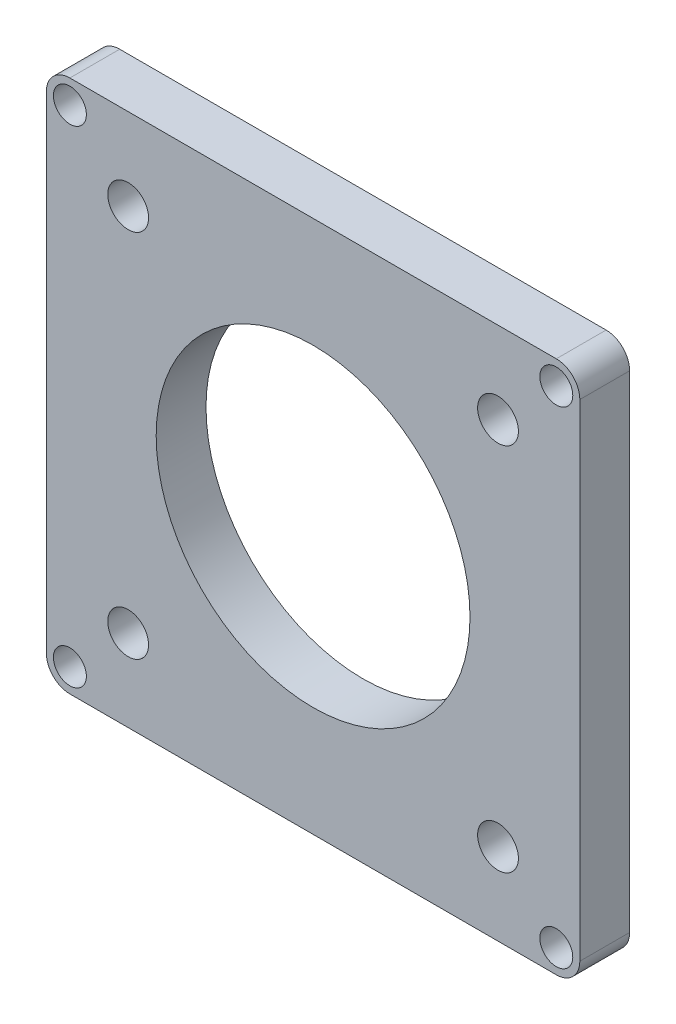
ISO-10303-21;
HEADER;
FILE_DESCRIPTION(('STEP AP214'),'2;1');
FILE_NAME('part.step','',(''),(''),'','','');
FILE_SCHEMA(('AUTOMOTIVE_DESIGN { 1 0 10303 214 1 1 1 1 }'));
ENDSEC;
DATA;
#1=APPLICATION_CONTEXT('core data for automotive mechanical design processes');
#2=APPLICATION_PROTOCOL_DEFINITION('international standard','automotive_design',2000,#1);
#3=PRODUCT_CONTEXT('',#1,'mechanical');
#4=PRODUCT('Part','Part','',(#3));
#5=PRODUCT_RELATED_PRODUCT_CATEGORY('part','',(#4));
#6=PRODUCT_DEFINITION_FORMATION('','',#4);
#7=PRODUCT_DEFINITION_CONTEXT('part definition',#1,'design');
#8=PRODUCT_DEFINITION('design','',#6,#7);
#9=PRODUCT_DEFINITION_SHAPE('','',#8);
#10=(LENGTH_UNIT() NAMED_UNIT(*) SI_UNIT(.MILLI.,.METRE.));
#11=(NAMED_UNIT(*) PLANE_ANGLE_UNIT() SI_UNIT($,.RADIAN.));
#12=(NAMED_UNIT(*) SI_UNIT($,.STERADIAN.) SOLID_ANGLE_UNIT());
#13=UNCERTAINTY_MEASURE_WITH_UNIT(LENGTH_MEASURE(1.E-05),#10,'distance_accuracy_value','');
#14=(GEOMETRIC_REPRESENTATION_CONTEXT(3) GLOBAL_UNCERTAINTY_ASSIGNED_CONTEXT((#13)) GLOBAL_UNIT_ASSIGNED_CONTEXT((#10,
#11,#12)) REPRESENTATION_CONTEXT('',''));
#15=CARTESIAN_POINT('',(0.,0.,0.));
#16=DIRECTION('',(0.,0.,1.));
#17=DIRECTION('',(1.,0.,0.));
#18=AXIS2_PLACEMENT_3D('',#15,#16,#17);
#19=CARTESIAN_POINT('',(0.,0.,3.175));
#20=DIRECTION('',(0.,0.,1.));
#21=DIRECTION('',(1.,0.,0.));
#22=AXIS2_PLACEMENT_3D('',#19,#20,#21);
#23=PLANE('',#22);
#24=CARTESIAN_POINT('',(-23.5700000000002,-23.5699999999998,3.175));
#25=DIRECTION('',(0.,0.,1.));
#26=DIRECTION('',(1.,0.,0.));
#27=AXIS2_PLACEMENT_3D('',#24,#25,#26);
#28=CIRCLE('',#27,2.6);
#29=CARTESIAN_POINT('',(-20.9700000000002,-23.5699999999998,3.175));
#30=VERTEX_POINT('',#29);
#31=EDGE_CURVE('E360',#30,#30,#28,.T.);
#32=ORIENTED_EDGE('',*,*,#31,.F.);
#33=EDGE_LOOP('',(#32));
#34=FACE_BOUND('',#33,.T.);
#35=CARTESIAN_POINT('',(23.5699999999998,-23.5700000000002,3.175));
#36=DIRECTION('',(0.,0.,1.));
#37=DIRECTION('',(1.,0.,0.));
#38=AXIS2_PLACEMENT_3D('',#35,#36,#37);
#39=CIRCLE('',#38,2.6);
#40=CARTESIAN_POINT('',(26.1699999999998,-23.5700000000002,3.175));
#41=VERTEX_POINT('',#40);
#42=EDGE_CURVE('E343',#41,#41,#39,.T.);
#43=ORIENTED_EDGE('',*,*,#42,.F.);
#44=EDGE_LOOP('',(#43));
#45=FACE_BOUND('',#44,.T.);
#46=CARTESIAN_POINT('',(31.,31.,3.175));
#47=DIRECTION('',(0.,0.,1.));
#48=DIRECTION('',(1.,0.,0.));
#49=AXIS2_PLACEMENT_3D('',#46,#47,#48);
#50=CIRCLE('',#49,2.1);
#51=CARTESIAN_POINT('',(33.1,31.,3.175));
#52=VERTEX_POINT('',#51);
#53=EDGE_CURVE('E334',#52,#52,#50,.T.);
#54=ORIENTED_EDGE('',*,*,#53,.F.);
#55=EDGE_LOOP('',(#54));
#56=FACE_BOUND('',#55,.T.);
#57=CARTESIAN_POINT('',(-23.57,23.57,3.175));
#58=DIRECTION('',(0.,0.,1.));
#59=DIRECTION('',(1.,0.,0.));
#60=AXIS2_PLACEMENT_3D('',#57,#58,#59);
#61=CIRCLE('',#60,2.6);
#62=CARTESIAN_POINT('',(-20.97,23.57,3.175));
#63=VERTEX_POINT('',#62);
#64=EDGE_CURVE('E325',#63,#63,#61,.T.);
#65=ORIENTED_EDGE('',*,*,#64,.F.);
#66=EDGE_LOOP('',(#65));
#67=FACE_BOUND('',#66,.T.);
#68=DIRECTION('',(1.,0.,0.));
#69=VECTOR('',#68,1.);
#70=CARTESIAN_POINT('',(-34.,34.,3.175));
#71=LINE('',#70,#69);
#72=CARTESIAN_POINT('',(-31.,34.,3.175));
#73=VERTEX_POINT('',#72);
#74=CARTESIAN_POINT('',(31.,34.,3.175));
#75=VERTEX_POINT('',#74);
#76=EDGE_CURVE('E280',#73,#75,#71,.T.);
#77=ORIENTED_EDGE('',*,*,#76,.F.);
#78=CARTESIAN_POINT('',(-31.,31.,3.175));
#79=DIRECTION('',(0.,0.,1.));
#80=DIRECTION('',(1.,0.,0.));
#81=AXIS2_PLACEMENT_3D('',#78,#79,#80);
#82=CIRCLE('',#81,3.);
#83=CARTESIAN_POINT('',(-34.,31.,3.175));
#84=VERTEX_POINT('',#83);
#85=EDGE_CURVE('E300',#73,#84,#82,.T.);
#86=ORIENTED_EDGE('',*,*,#85,.T.);
#87=DIRECTION('',(0.,-1.,0.));
#88=VECTOR('',#87,1.);
#89=CARTESIAN_POINT('',(-34.,34.,3.175));
#90=LINE('',#89,#88);
#91=CARTESIAN_POINT('',(-34.,-31.,3.175));
#92=VERTEX_POINT('',#91);
#93=EDGE_CURVE('E257',#84,#92,#90,.T.);
#94=ORIENTED_EDGE('',*,*,#93,.T.);
#95=CARTESIAN_POINT('',(-31.,-31.,3.175));
#96=DIRECTION('',(0.,0.,1.));
#97=DIRECTION('',(1.,0.,0.));
#98=AXIS2_PLACEMENT_3D('',#95,#96,#97);
#99=CIRCLE('',#98,3.);
#100=CARTESIAN_POINT('',(-31.,-34.,3.175));
#101=VERTEX_POINT('',#100);
#102=EDGE_CURVE('E293',#92,#101,#99,.T.);
#103=ORIENTED_EDGE('',*,*,#102,.T.);
#104=DIRECTION('',(1.,0.,0.));
#105=VECTOR('',#104,1.);
#106=CARTESIAN_POINT('',(-34.,-34.,3.175));
#107=LINE('',#106,#105);
#108=CARTESIAN_POINT('',(31.,-34.,3.175));
#109=VERTEX_POINT('',#108);
#110=EDGE_CURVE('E306',#101,#109,#107,.T.);
#111=ORIENTED_EDGE('',*,*,#110,.T.);
#112=CARTESIAN_POINT('',(31.,-31.,3.175));
#113=DIRECTION('',(0.,0.,1.));
#114=DIRECTION('',(1.,0.,0.));
#115=AXIS2_PLACEMENT_3D('',#112,#113,#114);
#116=CIRCLE('',#115,3.);
#117=CARTESIAN_POINT('',(34.,-31.,3.175));
#118=VERTEX_POINT('',#117);
#119=EDGE_CURVE('E188',#109,#118,#116,.T.);
#120=ORIENTED_EDGE('',*,*,#119,.T.);
#121=DIRECTION('',(0.,-1.,0.));
#122=VECTOR('',#121,1.);
#123=CARTESIAN_POINT('',(34.,34.,3.175));
#124=LINE('',#123,#122);
#125=CARTESIAN_POINT('',(34.,31.,3.175));
#126=VERTEX_POINT('',#125);
#127=EDGE_CURVE('E312',#126,#118,#124,.T.);
#128=ORIENTED_EDGE('',*,*,#127,.F.);
#129=CARTESIAN_POINT('',(31.,31.,3.175));
#130=DIRECTION('',(0.,0.,1.));
#131=DIRECTION('',(1.,0.,0.));
#132=AXIS2_PLACEMENT_3D('',#129,#130,#131);
#133=CIRCLE('',#132,3.);
#134=EDGE_CURVE('E295',#126,#75,#133,.T.);
#135=ORIENTED_EDGE('',*,*,#134,.T.);
#136=EDGE_LOOP('',(#77,#86,#94,#103,#111,#120,#128,#135));
#137=FACE_BOUND('',#136,.T.);
#138=CARTESIAN_POINT('',(-31.,-31.,3.175));
#139=DIRECTION('',(0.,0.,1.));
#140=DIRECTION('',(1.,0.,0.));
#141=AXIS2_PLACEMENT_3D('',#138,#139,#140);
#142=CIRCLE('',#141,2.1);
#143=CARTESIAN_POINT('',(-28.9,-31.,3.175));
#144=VERTEX_POINT('',#143);
#145=EDGE_CURVE('E268',#144,#144,#142,.T.);
#146=ORIENTED_EDGE('',*,*,#145,.F.);
#147=EDGE_LOOP('',(#146));
#148=FACE_BOUND('',#147,.T.);
#149=CARTESIAN_POINT('',(-31.,31.,3.175));
#150=DIRECTION('',(0.,0.,1.));
#151=DIRECTION('',(1.,0.,0.));
#152=AXIS2_PLACEMENT_3D('',#149,#150,#151);
#153=CIRCLE('',#152,2.1);
#154=CARTESIAN_POINT('',(-28.9,31.,3.175));
#155=VERTEX_POINT('',#154);
#156=EDGE_CURVE('E330',#155,#155,#153,.T.);
#157=ORIENTED_EDGE('',*,*,#156,.F.);
#158=EDGE_LOOP('',(#157));
#159=FACE_BOUND('',#158,.T.);
#160=CARTESIAN_POINT('',(23.5700000000001,23.5699999999999,3.175));
#161=DIRECTION('',(0.,0.,1.));
#162=DIRECTION('',(1.,0.,0.));
#163=AXIS2_PLACEMENT_3D('',#160,#161,#162);
#164=CIRCLE('',#163,2.6);
#165=CARTESIAN_POINT('',(26.1700000000001,23.5699999999999,3.175));
#166=VERTEX_POINT('',#165);
#167=EDGE_CURVE('E338',#166,#166,#164,.T.);
#168=ORIENTED_EDGE('',*,*,#167,.F.);
#169=EDGE_LOOP('',(#168));
#170=FACE_BOUND('',#169,.T.);
#171=CARTESIAN_POINT('',(31.,-31.,3.175));
#172=DIRECTION('',(0.,0.,1.));
#173=DIRECTION('',(1.,0.,0.));
#174=AXIS2_PLACEMENT_3D('',#171,#172,#173);
#175=CIRCLE('',#174,2.09999999999999);
#176=CARTESIAN_POINT('',(33.1,-31.,3.175));
#177=VERTEX_POINT('',#176);
#178=EDGE_CURVE('E351',#177,#177,#175,.T.);
#179=ORIENTED_EDGE('',*,*,#178,.F.);
#180=EDGE_LOOP('',(#179));
#181=FACE_BOUND('',#180,.T.);
#182=CARTESIAN_POINT('',(0.,0.,3.175));
#183=DIRECTION('',(0.,0.,1.));
#184=DIRECTION('',(1.,0.,0.));
#185=AXIS2_PLACEMENT_3D('',#182,#183,#184);
#186=CIRCLE('',#185,20.);
#187=CARTESIAN_POINT('',(20.,0.,3.175));
#188=VERTEX_POINT('',#187);
#189=EDGE_CURVE('E361',#188,#188,#186,.T.);
#190=ORIENTED_EDGE('',*,*,#189,.F.);
#191=EDGE_LOOP('',(#190));
#192=FACE_BOUND('',#191,.T.);
#193=ADVANCED_FACE('F173',(#34,#45,#56,#67,#137,#148,#159,#170,#181,#192),#23,.T.);
#194=CARTESIAN_POINT('',(0.,0.,-3.175));
#195=DIRECTION('',(0.,0.,1.));
#196=DIRECTION('',(1.,0.,0.));
#197=AXIS2_PLACEMENT_3D('',#194,#195,#196);
#198=PLANE('',#197);
#199=DIRECTION('',(0.,-1.,0.));
#200=VECTOR('',#199,1.);
#201=CARTESIAN_POINT('',(-34.,34.,-3.175));
#202=LINE('',#201,#200);
#203=CARTESIAN_POINT('',(-34.,31.,-3.175));
#204=VERTEX_POINT('',#203);
#205=CARTESIAN_POINT('',(-34.,-31.,-3.175));
#206=VERTEX_POINT('',#205);
#207=EDGE_CURVE('E260',#204,#206,#202,.T.);
#208=ORIENTED_EDGE('',*,*,#207,.F.);
#209=CARTESIAN_POINT('',(-31.,31.,-3.175));
#210=DIRECTION('',(0.,0.,1.));
#211=DIRECTION('',(1.,0.,0.));
#212=AXIS2_PLACEMENT_3D('',#209,#210,#211);
#213=CIRCLE('',#212,3.);
#214=CARTESIAN_POINT('',(-31.,34.,-3.175));
#215=VERTEX_POINT('',#214);
#216=EDGE_CURVE('E238',#204,#215,#213,.F.);
#217=ORIENTED_EDGE('',*,*,#216,.T.);
#218=DIRECTION('',(1.,0.,0.));
#219=VECTOR('',#218,1.);
#220=CARTESIAN_POINT('',(-34.,34.,-3.175));
#221=LINE('',#220,#219);
#222=CARTESIAN_POINT('',(31.,34.,-3.175));
#223=VERTEX_POINT('',#222);
#224=EDGE_CURVE('E285',#215,#223,#221,.T.);
#225=ORIENTED_EDGE('',*,*,#224,.T.);
#226=CARTESIAN_POINT('',(31.,31.,-3.175));
#227=DIRECTION('',(0.,0.,1.));
#228=DIRECTION('',(1.,0.,0.));
#229=AXIS2_PLACEMENT_3D('',#226,#227,#228);
#230=CIRCLE('',#229,3.);
#231=CARTESIAN_POINT('',(34.,31.,-3.175));
#232=VERTEX_POINT('',#231);
#233=EDGE_CURVE('E261',#223,#232,#230,.F.);
#234=ORIENTED_EDGE('',*,*,#233,.T.);
#235=DIRECTION('',(0.,-1.,0.));
#236=VECTOR('',#235,1.);
#237=CARTESIAN_POINT('',(34.,34.,-3.175));
#238=LINE('',#237,#236);
#239=CARTESIAN_POINT('',(34.,-31.,-3.175));
#240=VERTEX_POINT('',#239);
#241=EDGE_CURVE('E271',#232,#240,#238,.T.);
#242=ORIENTED_EDGE('',*,*,#241,.T.);
#243=CARTESIAN_POINT('',(31.,-31.,-3.175));
#244=DIRECTION('',(0.,0.,1.));
#245=DIRECTION('',(1.,0.,0.));
#246=AXIS2_PLACEMENT_3D('',#243,#244,#245);
#247=CIRCLE('',#246,3.);
#248=CARTESIAN_POINT('',(31.,-34.,-3.175));
#249=VERTEX_POINT('',#248);
#250=EDGE_CURVE('E287',#240,#249,#247,.F.);
#251=ORIENTED_EDGE('',*,*,#250,.T.);
#252=DIRECTION('',(1.,0.,0.));
#253=VECTOR('',#252,1.);
#254=CARTESIAN_POINT('',(-34.,-34.,-3.175));
#255=LINE('',#254,#253);
#256=CARTESIAN_POINT('',(-31.,-34.,-3.175));
#257=VERTEX_POINT('',#256);
#258=EDGE_CURVE('E270',#257,#249,#255,.T.);
#259=ORIENTED_EDGE('',*,*,#258,.F.);
#260=CARTESIAN_POINT('',(-31.,-31.,-3.175));
#261=DIRECTION('',(0.,0.,1.));
#262=DIRECTION('',(1.,0.,0.));
#263=AXIS2_PLACEMENT_3D('',#260,#261,#262);
#264=CIRCLE('',#263,3.);
#265=EDGE_CURVE('E253',#257,#206,#264,.F.);
#266=ORIENTED_EDGE('',*,*,#265,.T.);
#267=EDGE_LOOP('',(#208,#217,#225,#234,#242,#251,#259,#266));
#268=FACE_BOUND('',#267,.T.);
#269=CARTESIAN_POINT('',(-31.,-31.,-3.175));
#270=DIRECTION('',(0.,0.,1.));
#271=DIRECTION('',(1.,0.,0.));
#272=AXIS2_PLACEMENT_3D('',#269,#270,#271);
#273=CIRCLE('',#272,2.1);
#274=CARTESIAN_POINT('',(-28.9,-31.,-3.175));
#275=VERTEX_POINT('',#274);
#276=EDGE_CURVE('E273',#275,#275,#273,.T.);
#277=ORIENTED_EDGE('',*,*,#276,.T.);
#278=EDGE_LOOP('',(#277));
#279=FACE_BOUND('',#278,.T.);
#280=CARTESIAN_POINT('',(-23.57,23.57,-3.175));
#281=DIRECTION('',(0.,0.,1.));
#282=DIRECTION('',(1.,0.,0.));
#283=AXIS2_PLACEMENT_3D('',#280,#281,#282);
#284=CIRCLE('',#283,2.6);
#285=CARTESIAN_POINT('',(-20.97,23.57,-3.175));
#286=VERTEX_POINT('',#285);
#287=EDGE_CURVE('E322',#286,#286,#284,.T.);
#288=ORIENTED_EDGE('',*,*,#287,.T.);
#289=EDGE_LOOP('',(#288));
#290=FACE_BOUND('',#289,.T.);
#291=CARTESIAN_POINT('',(-31.,31.,-3.175));
#292=DIRECTION('',(0.,0.,1.));
#293=DIRECTION('',(1.,0.,0.));
#294=AXIS2_PLACEMENT_3D('',#291,#292,#293);
#295=CIRCLE('',#294,2.1);
#296=CARTESIAN_POINT('',(-28.9,31.,-3.175));
#297=VERTEX_POINT('',#296);
#298=EDGE_CURVE('E329',#297,#297,#295,.T.);
#299=ORIENTED_EDGE('',*,*,#298,.T.);
#300=EDGE_LOOP('',(#299));
#301=FACE_BOUND('',#300,.T.);
#302=CARTESIAN_POINT('',(31.,31.,-3.175));
#303=DIRECTION('',(0.,0.,1.));
#304=DIRECTION('',(1.,0.,0.));
#305=AXIS2_PLACEMENT_3D('',#302,#303,#304);
#306=CIRCLE('',#305,2.1);
#307=CARTESIAN_POINT('',(33.1,31.,-3.175));
#308=VERTEX_POINT('',#307);
#309=EDGE_CURVE('E336',#308,#308,#306,.T.);
#310=ORIENTED_EDGE('',*,*,#309,.T.);
#311=EDGE_LOOP('',(#310));
#312=FACE_BOUND('',#311,.T.);
#313=CARTESIAN_POINT('',(23.5700000000001,23.5699999999999,-3.175));
#314=DIRECTION('',(0.,0.,1.));
#315=DIRECTION('',(1.,0.,0.));
#316=AXIS2_PLACEMENT_3D('',#313,#314,#315);
#317=CIRCLE('',#316,2.6);
#318=CARTESIAN_POINT('',(26.1700000000001,23.5699999999999,-3.175));
#319=VERTEX_POINT('',#318);
#320=EDGE_CURVE('E345',#319,#319,#317,.T.);
#321=ORIENTED_EDGE('',*,*,#320,.T.);
#322=EDGE_LOOP('',(#321));
#323=FACE_BOUND('',#322,.T.);
#324=CARTESIAN_POINT('',(23.5699999999998,-23.5700000000002,-3.175));
#325=DIRECTION('',(0.,0.,1.));
#326=DIRECTION('',(1.,0.,0.));
#327=AXIS2_PLACEMENT_3D('',#324,#325,#326);
#328=CIRCLE('',#327,2.6);
#329=CARTESIAN_POINT('',(26.1699999999998,-23.5700000000002,-3.175));
#330=VERTEX_POINT('',#329);
#331=EDGE_CURVE('E346',#330,#330,#328,.T.);
#332=ORIENTED_EDGE('',*,*,#331,.T.);
#333=EDGE_LOOP('',(#332));
#334=FACE_BOUND('',#333,.T.);
#335=CARTESIAN_POINT('',(31.,-31.,-3.175));
#336=DIRECTION('',(0.,0.,1.));
#337=DIRECTION('',(1.,0.,0.));
#338=AXIS2_PLACEMENT_3D('',#335,#336,#337);
#339=CIRCLE('',#338,2.09999999999999);
#340=CARTESIAN_POINT('',(33.1,-31.,-3.175));
#341=VERTEX_POINT('',#340);
#342=EDGE_CURVE('E353',#341,#341,#339,.T.);
#343=ORIENTED_EDGE('',*,*,#342,.T.);
#344=EDGE_LOOP('',(#343));
#345=FACE_BOUND('',#344,.T.);
#346=CARTESIAN_POINT('',(-23.5700000000002,-23.5699999999998,-3.175));
#347=DIRECTION('',(0.,0.,1.));
#348=DIRECTION('',(1.,0.,0.));
#349=AXIS2_PLACEMENT_3D('',#346,#347,#348);
#350=CIRCLE('',#349,2.6);
#351=CARTESIAN_POINT('',(-20.9700000000002,-23.5699999999998,-3.175));
#352=VERTEX_POINT('',#351);
#353=EDGE_CURVE('E358',#352,#352,#350,.T.);
#354=ORIENTED_EDGE('',*,*,#353,.T.);
#355=EDGE_LOOP('',(#354));
#356=FACE_BOUND('',#355,.T.);
#357=CARTESIAN_POINT('',(0.,0.,-3.175));
#358=DIRECTION('',(0.,0.,1.));
#359=DIRECTION('',(1.,0.,0.));
#360=AXIS2_PLACEMENT_3D('',#357,#358,#359);
#361=CIRCLE('',#360,20.);
#362=CARTESIAN_POINT('',(20.,0.,-3.175));
#363=VERTEX_POINT('',#362);
#364=EDGE_CURVE('E368',#363,#363,#361,.T.);
#365=ORIENTED_EDGE('',*,*,#364,.T.);
#366=EDGE_LOOP('',(#365));
#367=FACE_BOUND('',#366,.T.);
#368=ADVANCED_FACE('F262',(#268,#279,#290,#301,#312,#323,#334,#345,#356,#367),#198,.F.);
#369=CARTESIAN_POINT('',(-34.,34.,3.175));
#370=DIRECTION('',(1.,0.,0.));
#371=DIRECTION('',(0.,0.,-1.));
#372=AXIS2_PLACEMENT_3D('',#369,#370,#371);
#373=PLANE('',#372);
#374=ORIENTED_EDGE('',*,*,#93,.F.);
#375=DIRECTION('',(0.,0.,-1.));
#376=VECTOR('',#375,1.);
#377=CARTESIAN_POINT('',(-34.,31.,-3.175));
#378=LINE('',#377,#376);
#379=EDGE_CURVE('E243',#84,#204,#378,.T.);
#380=ORIENTED_EDGE('',*,*,#379,.T.);
#381=ORIENTED_EDGE('',*,*,#207,.T.);
#382=DIRECTION('',(0.,0.,-1.));
#383=VECTOR('',#382,1.);
#384=CARTESIAN_POINT('',(-34.,-31.,3.175));
#385=LINE('',#384,#383);
#386=EDGE_CURVE('E265',#206,#92,#385,.F.);
#387=ORIENTED_EDGE('',*,*,#386,.T.);
#388=EDGE_LOOP('',(#374,#380,#381,#387));
#389=FACE_BOUND('',#388,.T.);
#390=ADVANCED_FACE('F258',(#389),#373,.F.);
#391=CARTESIAN_POINT('',(-34.,-34.,3.175));
#392=DIRECTION('',(0.,1.,0.));
#393=DIRECTION('',(0.,0.,1.));
#394=AXIS2_PLACEMENT_3D('',#391,#392,#393);
#395=PLANE('',#394);
#396=ORIENTED_EDGE('',*,*,#110,.F.);
#397=DIRECTION('',(0.,0.,-1.));
#398=VECTOR('',#397,1.);
#399=CARTESIAN_POINT('',(-31.,-34.,3.175));
#400=LINE('',#399,#398);
#401=EDGE_CURVE('E302',#101,#257,#400,.T.);
#402=ORIENTED_EDGE('',*,*,#401,.T.);
#403=ORIENTED_EDGE('',*,*,#258,.T.);
#404=DIRECTION('',(0.,0.,-1.));
#405=VECTOR('',#404,1.);
#406=CARTESIAN_POINT('',(31.,-34.,3.175));
#407=LINE('',#406,#405);
#408=EDGE_CURVE('E298',#249,#109,#407,.F.);
#409=ORIENTED_EDGE('',*,*,#408,.T.);
#410=EDGE_LOOP('',(#396,#402,#403,#409));
#411=FACE_BOUND('',#410,.T.);
#412=ADVANCED_FACE('F308',(#411),#395,.F.);
#413=CARTESIAN_POINT('',(34.,34.,3.175));
#414=DIRECTION('',(1.,0.,0.));
#415=DIRECTION('',(0.,0.,-1.));
#416=AXIS2_PLACEMENT_3D('',#413,#414,#415);
#417=PLANE('',#416);
#418=ORIENTED_EDGE('',*,*,#127,.T.);
#419=DIRECTION('',(0.,0.,-1.));
#420=VECTOR('',#419,1.);
#421=CARTESIAN_POINT('',(34.,-31.,-3.175));
#422=LINE('',#421,#420);
#423=EDGE_CURVE('E12',#118,#240,#422,.T.);
#424=ORIENTED_EDGE('',*,*,#423,.T.);
#425=ORIENTED_EDGE('',*,*,#241,.F.);
#426=DIRECTION('',(0.,0.,-1.));
#427=VECTOR('',#426,1.);
#428=CARTESIAN_POINT('',(34.,31.,3.175));
#429=LINE('',#428,#427);
#430=EDGE_CURVE('E185',#232,#126,#429,.F.);
#431=ORIENTED_EDGE('',*,*,#430,.T.);
#432=EDGE_LOOP('',(#418,#424,#425,#431));
#433=FACE_BOUND('',#432,.T.);
#434=ADVANCED_FACE('F314',(#433),#417,.T.);
#435=CARTESIAN_POINT('',(-34.,34.,3.175));
#436=DIRECTION('',(0.,1.,0.));
#437=DIRECTION('',(0.,0.,1.));
#438=AXIS2_PLACEMENT_3D('',#435,#436,#437);
#439=PLANE('',#438);
#440=ORIENTED_EDGE('',*,*,#224,.F.);
#441=DIRECTION('',(0.,0.,-1.));
#442=VECTOR('',#441,1.);
#443=CARTESIAN_POINT('',(-31.,34.,3.175));
#444=LINE('',#443,#442);
#445=EDGE_CURVE('E244',#215,#73,#444,.F.);
#446=ORIENTED_EDGE('',*,*,#445,.T.);
#447=ORIENTED_EDGE('',*,*,#76,.T.);
#448=DIRECTION('',(0.,0.,-1.));
#449=VECTOR('',#448,1.);
#450=CARTESIAN_POINT('',(31.,34.,3.175));
#451=LINE('',#450,#449);
#452=EDGE_CURVE('E248',#75,#223,#451,.T.);
#453=ORIENTED_EDGE('',*,*,#452,.T.);
#454=EDGE_LOOP('',(#440,#446,#447,#453));
#455=FACE_BOUND('',#454,.T.);
#456=ADVANCED_FACE('F386',(#455),#439,.T.);
#457=CARTESIAN_POINT('',(-31.,-31.,3.175));
#458=DIRECTION('',(0.,0.,-1.));
#459=DIRECTION('',(-1.,0.,0.));
#460=AXIS2_PLACEMENT_3D('',#457,#458,#459);
#461=CYLINDRICAL_SURFACE('',#460,2.1);
#462=ORIENTED_EDGE('',*,*,#145,.T.);
#463=EDGE_LOOP('',(#462));
#464=FACE_BOUND('',#463,.T.);
#465=ORIENTED_EDGE('',*,*,#276,.F.);
#466=EDGE_LOOP('',(#465));
#467=FACE_BOUND('',#466,.T.);
#468=ADVANCED_FACE('F387',(#464,#467),#461,.F.);
#469=CARTESIAN_POINT('',(-23.57,23.57,3.175));
#470=DIRECTION('',(0.,0.,-1.));
#471=DIRECTION('',(-1.,0.,0.));
#472=AXIS2_PLACEMENT_3D('',#469,#470,#471);
#473=CYLINDRICAL_SURFACE('',#472,2.6);
#474=ORIENTED_EDGE('',*,*,#64,.T.);
#475=EDGE_LOOP('',(#474));
#476=FACE_BOUND('',#475,.T.);
#477=ORIENTED_EDGE('',*,*,#287,.F.);
#478=EDGE_LOOP('',(#477));
#479=FACE_BOUND('',#478,.T.);
#480=ADVANCED_FACE('F454',(#476,#479),#473,.F.);
#481=CARTESIAN_POINT('',(-31.,31.,3.175));
#482=DIRECTION('',(0.,0.,-1.));
#483=DIRECTION('',(-1.,0.,0.));
#484=AXIS2_PLACEMENT_3D('',#481,#482,#483);
#485=CYLINDRICAL_SURFACE('',#484,2.1);
#486=ORIENTED_EDGE('',*,*,#156,.T.);
#487=EDGE_LOOP('',(#486));
#488=FACE_BOUND('',#487,.T.);
#489=ORIENTED_EDGE('',*,*,#298,.F.);
#490=EDGE_LOOP('',(#489));
#491=FACE_BOUND('',#490,.T.);
#492=ADVANCED_FACE('F449',(#488,#491),#485,.F.);
#493=CARTESIAN_POINT('',(31.,31.,3.175));
#494=DIRECTION('',(0.,0.,-1.));
#495=DIRECTION('',(-1.,0.,0.));
#496=AXIS2_PLACEMENT_3D('',#493,#494,#495);
#497=CYLINDRICAL_SURFACE('',#496,2.1);
#498=ORIENTED_EDGE('',*,*,#53,.T.);
#499=EDGE_LOOP('',(#498));
#500=FACE_BOUND('',#499,.T.);
#501=ORIENTED_EDGE('',*,*,#309,.F.);
#502=EDGE_LOOP('',(#501));
#503=FACE_BOUND('',#502,.T.);
#504=ADVANCED_FACE('F446',(#500,#503),#497,.F.);
#505=CARTESIAN_POINT('',(23.5700000000001,23.5699999999999,3.175));
#506=DIRECTION('',(0.,0.,-1.));
#507=DIRECTION('',(-1.,0.,0.));
#508=AXIS2_PLACEMENT_3D('',#505,#506,#507);
#509=CYLINDRICAL_SURFACE('',#508,2.6);
#510=ORIENTED_EDGE('',*,*,#167,.T.);
#511=EDGE_LOOP('',(#510));
#512=FACE_BOUND('',#511,.T.);
#513=ORIENTED_EDGE('',*,*,#320,.F.);
#514=EDGE_LOOP('',(#513));
#515=FACE_BOUND('',#514,.T.);
#516=ADVANCED_FACE('F445',(#512,#515),#509,.F.);
#517=CARTESIAN_POINT('',(23.5699999999998,-23.5700000000002,3.175));
#518=DIRECTION('',(0.,0.,-1.));
#519=DIRECTION('',(-1.,0.,0.));
#520=AXIS2_PLACEMENT_3D('',#517,#518,#519);
#521=CYLINDRICAL_SURFACE('',#520,2.6);
#522=ORIENTED_EDGE('',*,*,#42,.T.);
#523=EDGE_LOOP('',(#522));
#524=FACE_BOUND('',#523,.T.);
#525=ORIENTED_EDGE('',*,*,#331,.F.);
#526=EDGE_LOOP('',(#525));
#527=FACE_BOUND('',#526,.T.);
#528=ADVANCED_FACE('F422',(#524,#527),#521,.F.);
#529=CARTESIAN_POINT('',(31.,-31.,3.175));
#530=DIRECTION('',(0.,0.,-1.));
#531=DIRECTION('',(-1.,0.,0.));
#532=AXIS2_PLACEMENT_3D('',#529,#530,#531);
#533=CYLINDRICAL_SURFACE('',#532,2.09999999999999);
#534=ORIENTED_EDGE('',*,*,#178,.T.);
#535=EDGE_LOOP('',(#534));
#536=FACE_BOUND('',#535,.T.);
#537=ORIENTED_EDGE('',*,*,#342,.F.);
#538=EDGE_LOOP('',(#537));
#539=FACE_BOUND('',#538,.T.);
#540=ADVANCED_FACE('F423',(#536,#539),#533,.F.);
#541=CARTESIAN_POINT('',(-23.5700000000002,-23.5699999999998,3.175));
#542=DIRECTION('',(0.,0.,-1.));
#543=DIRECTION('',(-1.,0.,0.));
#544=AXIS2_PLACEMENT_3D('',#541,#542,#543);
#545=CYLINDRICAL_SURFACE('',#544,2.6);
#546=ORIENTED_EDGE('',*,*,#31,.T.);
#547=EDGE_LOOP('',(#546));
#548=FACE_BOUND('',#547,.T.);
#549=ORIENTED_EDGE('',*,*,#353,.F.);
#550=EDGE_LOOP('',(#549));
#551=FACE_BOUND('',#550,.T.);
#552=ADVANCED_FACE('F424',(#548,#551),#545,.F.);
#553=CARTESIAN_POINT('',(0.,0.,3.175));
#554=DIRECTION('',(0.,0.,-1.));
#555=DIRECTION('',(-1.,0.,0.));
#556=AXIS2_PLACEMENT_3D('',#553,#554,#555);
#557=CYLINDRICAL_SURFACE('',#556,20.);
#558=ORIENTED_EDGE('',*,*,#189,.T.);
#559=EDGE_LOOP('',(#558));
#560=FACE_BOUND('',#559,.T.);
#561=ORIENTED_EDGE('',*,*,#364,.F.);
#562=EDGE_LOOP('',(#561));
#563=FACE_BOUND('',#562,.T.);
#564=ADVANCED_FACE('F375',(#560,#563),#557,.F.);
#565=CARTESIAN_POINT('',(-31.,31.,3.175));
#566=DIRECTION('',(0.,0.,1.));
#567=DIRECTION('',(1.,0.,0.));
#568=AXIS2_PLACEMENT_3D('',#565,#566,#567);
#569=CYLINDRICAL_SURFACE('',#568,3.);
#570=ORIENTED_EDGE('',*,*,#85,.F.);
#571=ORIENTED_EDGE('',*,*,#445,.F.);
#572=ORIENTED_EDGE('',*,*,#216,.F.);
#573=ORIENTED_EDGE('',*,*,#379,.F.);
#574=EDGE_LOOP('',(#570,#571,#572,#573));
#575=FACE_BOUND('',#574,.T.);
#576=ADVANCED_FACE('F242',(#575),#569,.T.);
#577=CARTESIAN_POINT('',(-31.,-31.,3.175));
#578=DIRECTION('',(0.,0.,-1.));
#579=DIRECTION('',(-1.,0.,0.));
#580=AXIS2_PLACEMENT_3D('',#577,#578,#579);
#581=CYLINDRICAL_SURFACE('',#580,3.);
#582=ORIENTED_EDGE('',*,*,#102,.F.);
#583=ORIENTED_EDGE('',*,*,#386,.F.);
#584=ORIENTED_EDGE('',*,*,#265,.F.);
#585=ORIENTED_EDGE('',*,*,#401,.F.);
#586=EDGE_LOOP('',(#582,#583,#584,#585));
#587=FACE_BOUND('',#586,.T.);
#588=ADVANCED_FACE('F402',(#587),#581,.T.);
#589=CARTESIAN_POINT('',(31.,-31.,3.175));
#590=DIRECTION('',(0.,0.,1.));
#591=DIRECTION('',(1.,0.,0.));
#592=AXIS2_PLACEMENT_3D('',#589,#590,#591);
#593=CYLINDRICAL_SURFACE('',#592,3.);
#594=ORIENTED_EDGE('',*,*,#119,.F.);
#595=ORIENTED_EDGE('',*,*,#408,.F.);
#596=ORIENTED_EDGE('',*,*,#250,.F.);
#597=ORIENTED_EDGE('',*,*,#423,.F.);
#598=EDGE_LOOP('',(#594,#595,#596,#597));
#599=FACE_BOUND('',#598,.T.);
#600=ADVANCED_FACE('F311',(#599),#593,.T.);
#601=CARTESIAN_POINT('',(31.,31.,3.175));
#602=DIRECTION('',(0.,0.,-1.));
#603=DIRECTION('',(-1.,0.,0.));
#604=AXIS2_PLACEMENT_3D('',#601,#602,#603);
#605=CYLINDRICAL_SURFACE('',#604,3.);
#606=ORIENTED_EDGE('',*,*,#134,.F.);
#607=ORIENTED_EDGE('',*,*,#430,.F.);
#608=ORIENTED_EDGE('',*,*,#233,.F.);
#609=ORIENTED_EDGE('',*,*,#452,.F.);
#610=EDGE_LOOP('',(#606,#607,#608,#609));
#611=FACE_BOUND('',#610,.T.);
#612=ADVANCED_FACE('F177',(#611),#605,.T.);
#613=CLOSED_SHELL('',(#193,#368,#390,#412,#434,#456,#468,#480,#492,#504,#516,#528,#540,#552,
#564,#576,#588,#600,#612));
#614=MANIFOLD_SOLID_BREP('B2',#613);
#615=ADVANCED_BREP_SHAPE_REPRESENTATION('',(#18,#614),#14);
#616=SHAPE_DEFINITION_REPRESENTATION(#9,#615);
ENDSEC;
END-ISO-10303-21;
